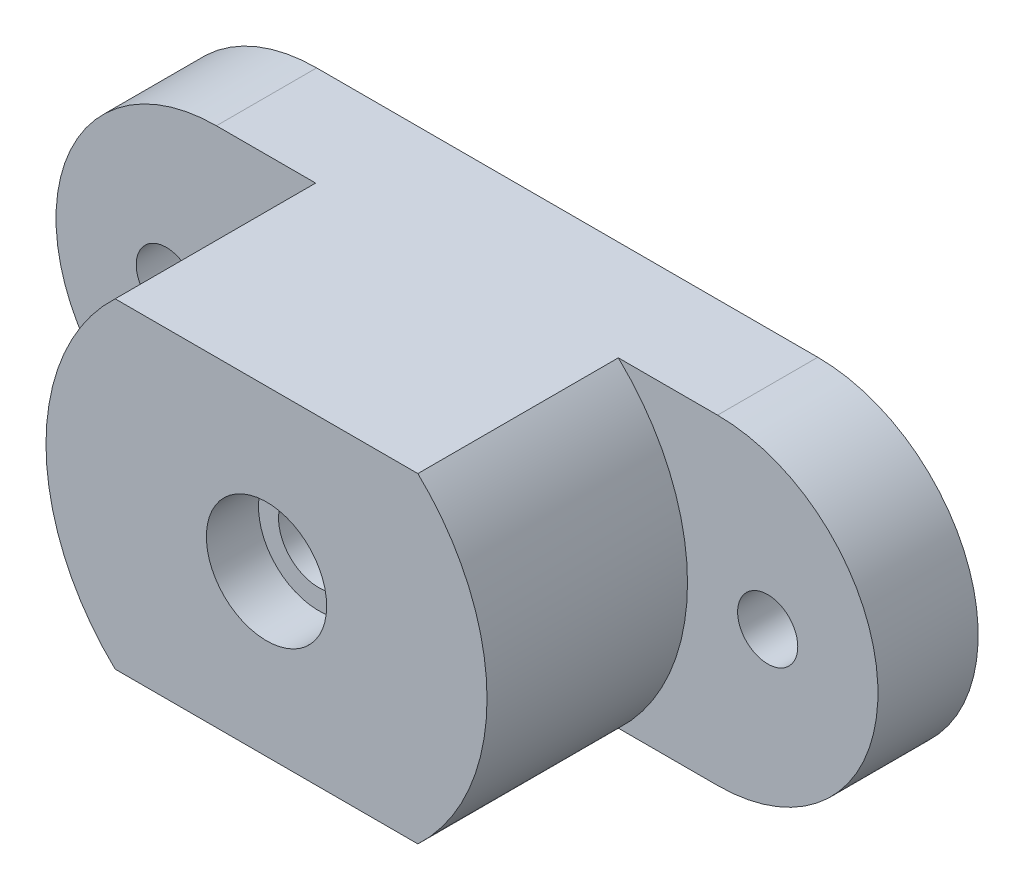
ISO-10303-21;
HEADER;
FILE_DESCRIPTION(('STEP AP214'),'2;1');
FILE_NAME('part.step','',(''),(''),'','','');
FILE_SCHEMA(('AUTOMOTIVE_DESIGN { 1 0 10303 214 1 1 1 1 }'));
ENDSEC;
DATA;
#1=APPLICATION_CONTEXT('core data for automotive mechanical design processes');
#2=APPLICATION_PROTOCOL_DEFINITION('international standard','automotive_design',2000,#1);
#3=PRODUCT_CONTEXT('',#1,'mechanical');
#4=PRODUCT('Part','Part','',(#3));
#5=PRODUCT_RELATED_PRODUCT_CATEGORY('part','',(#4));
#6=PRODUCT_DEFINITION_FORMATION('','',#4);
#7=PRODUCT_DEFINITION_CONTEXT('part definition',#1,'design');
#8=PRODUCT_DEFINITION('design','',#6,#7);
#9=PRODUCT_DEFINITION_SHAPE('','',#8);
#10=(LENGTH_UNIT() NAMED_UNIT(*) SI_UNIT(.MILLI.,.METRE.));
#11=(NAMED_UNIT(*) PLANE_ANGLE_UNIT() SI_UNIT($,.RADIAN.));
#12=(NAMED_UNIT(*) SI_UNIT($,.STERADIAN.) SOLID_ANGLE_UNIT());
#13=UNCERTAINTY_MEASURE_WITH_UNIT(LENGTH_MEASURE(1.E-05),#10,'distance_accuracy_value','');
#14=(GEOMETRIC_REPRESENTATION_CONTEXT(3) GLOBAL_UNCERTAINTY_ASSIGNED_CONTEXT((#13)) GLOBAL_UNIT_ASSIGNED_CONTEXT((#10,
#11,#12)) REPRESENTATION_CONTEXT('',''));
#15=CARTESIAN_POINT('',(0.,0.,0.));
#16=DIRECTION('',(0.,0.,1.));
#17=DIRECTION('',(1.,0.,0.));
#18=AXIS2_PLACEMENT_3D('',#15,#16,#17);
#19=CARTESIAN_POINT('',(12.5,0.,0.));
#20=DIRECTION('',(0.,0.,1.));
#21=DIRECTION('',(1.,0.,0.));
#22=AXIS2_PLACEMENT_3D('',#19,#20,#21);
#23=CYLINDRICAL_SURFACE('',#22,2.);
#24=CARTESIAN_POINT('',(12.5,0.,12.4));
#25=DIRECTION('',(0.,0.,1.));
#26=DIRECTION('',(1.,0.,0.));
#27=AXIS2_PLACEMENT_3D('',#24,#25,#26);
#28=CIRCLE('',#27,2.);
#29=CARTESIAN_POINT('',(14.5,0.,12.4));
#30=VERTEX_POINT('',#29);
#31=EDGE_CURVE('E188',#30,#30,#28,.T.);
#32=CARTESIAN_POINT('',(12.5,0.,10.));
#33=DIRECTION('',(0.,0.,-1.));
#34=DIRECTION('',(-1.,0.,0.));
#35=AXIS2_PLACEMENT_3D('',#32,#33,#34);
#36=CIRCLE('',#35,2.);
#37=CARTESIAN_POINT('',(14.5,0.,10.));
#38=VERTEX_POINT('',#37);
#39=EDGE_CURVE('E43',#38,#38,#36,.F.);
#40=CARTESIAN_POINT('',(14.5,0.,12.4));
#41=CARTESIAN_POINT('',(14.5,0.,12.375));
#42=CARTESIAN_POINT('',(14.5,0.,12.35));
#43=CARTESIAN_POINT('',(14.5,0.,12.3));
#44=CARTESIAN_POINT('',(14.5,0.,12.275));
#45=CARTESIAN_POINT('',(14.5,0.,12.225));
#46=CARTESIAN_POINT('',(14.5,0.,12.2));
#47=CARTESIAN_POINT('',(14.5,0.,12.15));
#48=CARTESIAN_POINT('',(14.5,0.,12.125));
#49=CARTESIAN_POINT('',(14.5,0.,12.075));
#50=CARTESIAN_POINT('',(14.5,0.,12.05));
#51=CARTESIAN_POINT('',(14.5,0.,12.));
#52=CARTESIAN_POINT('',(14.5,0.,11.975));
#53=CARTESIAN_POINT('',(14.5,0.,11.925));
#54=CARTESIAN_POINT('',(14.5,0.,11.9));
#55=CARTESIAN_POINT('',(14.5,0.,11.85));
#56=CARTESIAN_POINT('',(14.5,0.,11.825));
#57=CARTESIAN_POINT('',(14.5,0.,11.775));
#58=CARTESIAN_POINT('',(14.5,0.,11.75));
#59=CARTESIAN_POINT('',(14.5,0.,11.7));
#60=CARTESIAN_POINT('',(14.5,0.,11.675));
#61=CARTESIAN_POINT('',(14.5,0.,11.625));
#62=CARTESIAN_POINT('',(14.5,0.,11.6));
#63=CARTESIAN_POINT('',(14.5,0.,11.55));
#64=CARTESIAN_POINT('',(14.5,0.,11.525));
#65=CARTESIAN_POINT('',(14.5,0.,11.475));
#66=CARTESIAN_POINT('',(14.5,0.,11.45));
#67=CARTESIAN_POINT('',(14.5,0.,11.4));
#68=CARTESIAN_POINT('',(14.5,0.,11.375));
#69=CARTESIAN_POINT('',(14.5,0.,11.325));
#70=CARTESIAN_POINT('',(14.5,0.,11.3));
#71=CARTESIAN_POINT('',(14.5,0.,11.25));
#72=CARTESIAN_POINT('',(14.5,0.,11.225));
#73=CARTESIAN_POINT('',(14.5,0.,11.175));
#74=CARTESIAN_POINT('',(14.5,0.,11.15));
#75=CARTESIAN_POINT('',(14.5,0.,11.1));
#76=CARTESIAN_POINT('',(14.5,0.,11.075));
#77=CARTESIAN_POINT('',(14.5,0.,11.025));
#78=CARTESIAN_POINT('',(14.5,0.,11.));
#79=CARTESIAN_POINT('',(14.5,0.,10.95));
#80=CARTESIAN_POINT('',(14.5,0.,10.925));
#81=CARTESIAN_POINT('',(14.5,0.,10.875));
#82=CARTESIAN_POINT('',(14.5,0.,10.85));
#83=CARTESIAN_POINT('',(14.5,0.,10.8));
#84=CARTESIAN_POINT('',(14.5,0.,10.775));
#85=CARTESIAN_POINT('',(14.5,0.,10.725));
#86=CARTESIAN_POINT('',(14.5,0.,10.7));
#87=CARTESIAN_POINT('',(14.5,0.,10.65));
#88=CARTESIAN_POINT('',(14.5,0.,10.625));
#89=CARTESIAN_POINT('',(14.5,0.,10.575));
#90=CARTESIAN_POINT('',(14.5,0.,10.55));
#91=CARTESIAN_POINT('',(14.5,0.,10.5));
#92=CARTESIAN_POINT('',(14.5,0.,10.475));
#93=CARTESIAN_POINT('',(14.5,0.,10.425));
#94=CARTESIAN_POINT('',(14.5,0.,10.4));
#95=CARTESIAN_POINT('',(14.5,0.,10.35));
#96=CARTESIAN_POINT('',(14.5,0.,10.325));
#97=CARTESIAN_POINT('',(14.5,0.,10.275));
#98=CARTESIAN_POINT('',(14.5,0.,10.25));
#99=CARTESIAN_POINT('',(14.5,0.,10.2));
#100=CARTESIAN_POINT('',(14.5,0.,10.175));
#101=CARTESIAN_POINT('',(14.5,0.,10.125));
#102=CARTESIAN_POINT('',(14.5,0.,10.1));
#103=CARTESIAN_POINT('',(14.5,0.,10.05));
#104=CARTESIAN_POINT('',(14.5,0.,10.025));
#105=CARTESIAN_POINT('',(14.5,0.,10.));
#106=B_SPLINE_CURVE_WITH_KNOTS('',3,(#40,#41,#42,#43,#44,#45,#46,#47,#48,#49,#50,#51,#52,#53,
#54,#55,#56,#57,#58,#59,#60,#61,#62,#63,#64,#65,#66,#67,#68,#69,#70,#71,#72,#73,#74,#75,#76,#77,
#78,#79,#80,#81,#82,#83,#84,#85,#86,#87,#88,#89,#90,#91,#92,#93,#94,#95,#96,#97,#98,#99,#100,
#101,#102,#103,#104,#105),.UNSPECIFIED.,.F.,.F.,(4,2,2,2,2,2,2,2,2,2,2,2,2,2,2,2,2,2,2,2,2,2,2,
2,2,2,2,2,2,2,2,2,4),(0.,0.0750000000000004,0.150000000000001,0.225,0.3,0.375,0.449999999999999,
0.524999999999999,0.6,0.675,0.750000000000001,0.824999999999999,0.9,0.975,1.05,1.125,1.2,1.275,
1.35,1.425,1.5,1.575,1.65,1.725,1.8,1.875,1.95,2.025,2.1,2.175,2.25,2.325,2.4),.UNSPECIFIED.);
#107=EDGE_CURVE('BSEAM39',#30,#38,#106,.T.);
#108=ORIENTED_EDGE('',*,*,#31,.T.);
#109=ORIENTED_EDGE('',*,*,#39,.F.);
#110=ORIENTED_EDGE('',*,*,#107,.T.);
#111=ORIENTED_EDGE('',*,*,#107,.F.);
#112=EDGE_LOOP('',(#108,#110,#109,#111));
#113=FACE_BOUND('',#112,.T.);
#114=ADVANCED_FACE('F39',(#113),#23,.F.);
#115=CARTESIAN_POINT('',(0.,0.,5.));
#116=DIRECTION('',(0.,0.,1.));
#117=DIRECTION('',(1.,0.,0.));
#118=AXIS2_PLACEMENT_3D('',#115,#116,#117);
#119=PLANE('',#118);
#120=CARTESIAN_POINT('',(-2.5,0.,5.));
#121=DIRECTION('',(0.,0.,1.));
#122=DIRECTION('',(1.,0.,0.));
#123=AXIS2_PLACEMENT_3D('',#120,#121,#122);
#124=CIRCLE('',#123,1.5);
#125=CARTESIAN_POINT('',(-1.,0.,5.));
#126=VERTEX_POINT('',#125);
#127=EDGE_CURVE('E206',#126,#126,#124,.T.);
#128=ORIENTED_EDGE('',*,*,#127,.F.);
#129=EDGE_LOOP('',(#128));
#130=FACE_BOUND('',#129,.T.);
#131=CARTESIAN_POINT('',(12.5,0.,5.));
#132=DIRECTION('',(0.,0.,1.));
#133=DIRECTION('',(1.,0.,0.));
#134=AXIS2_PLACEMENT_3D('',#131,#132,#133);
#135=CIRCLE('',#134,11.);
#136=CARTESIAN_POINT('',(4.95016556472925,8.,5.));
#137=VERTEX_POINT('',#136);
#138=CARTESIAN_POINT('',(4.95016556472925,-8.,5.));
#139=VERTEX_POINT('',#138);
#140=EDGE_CURVE('E55',#137,#139,#135,.T.);
#141=ORIENTED_EDGE('',*,*,#140,.F.);
#142=DIRECTION('',(-1.,0.,0.));
#143=VECTOR('',#142,1.);
#144=CARTESIAN_POINT('',(0.,8.,5.));
#145=LINE('',#144,#143);
#146=CARTESIAN_POINT('',(0.,8.,5.));
#147=VERTEX_POINT('',#146);
#148=EDGE_CURVE('E144',#137,#147,#145,.T.);
#149=ORIENTED_EDGE('',*,*,#148,.T.);
#150=CARTESIAN_POINT('',(0.,0.,5.));
#151=DIRECTION('',(0.,0.,1.));
#152=DIRECTION('',(1.,0.,0.));
#153=AXIS2_PLACEMENT_3D('',#150,#151,#152);
#154=CIRCLE('',#153,8.);
#155=CARTESIAN_POINT('',(0.,-8.,5.));
#156=VERTEX_POINT('',#155);
#157=EDGE_CURVE('E135',#147,#156,#154,.T.);
#158=ORIENTED_EDGE('',*,*,#157,.T.);
#159=DIRECTION('',(1.,0.,0.));
#160=VECTOR('',#159,1.);
#161=CARTESIAN_POINT('',(0.,-8.,5.));
#162=LINE('',#161,#160);
#163=EDGE_CURVE('E140',#156,#139,#162,.T.);
#164=ORIENTED_EDGE('',*,*,#163,.T.);
#165=EDGE_LOOP('',(#141,#149,#158,#164));
#166=FACE_BOUND('',#165,.T.);
#167=ADVANCED_FACE('F175',(#130,#166),#119,.T.);
#168=CARTESIAN_POINT('',(0.,0.,5.));
#169=DIRECTION('',(0.,0.,-1.));
#170=DIRECTION('',(-1.,0.,0.));
#171=AXIS2_PLACEMENT_3D('',#168,#169,#170);
#172=CYLINDRICAL_SURFACE('',#171,8.);
#173=CARTESIAN_POINT('',(0.,0.,0.));
#174=DIRECTION('',(0.,0.,1.));
#175=DIRECTION('',(1.,0.,0.));
#176=AXIS2_PLACEMENT_3D('',#173,#174,#175);
#177=CIRCLE('',#176,8.);
#178=CARTESIAN_POINT('',(0.,8.,0.));
#179=VERTEX_POINT('',#178);
#180=CARTESIAN_POINT('',(0.,-8.,0.));
#181=VERTEX_POINT('',#180);
#182=EDGE_CURVE('E126',#179,#181,#177,.T.);
#183=ORIENTED_EDGE('',*,*,#182,.T.);
#184=DIRECTION('',(0.,0.,-1.));
#185=VECTOR('',#184,1.);
#186=CARTESIAN_POINT('',(0.,-8.,5.));
#187=LINE('',#186,#185);
#188=EDGE_CURVE('E11',#156,#181,#187,.T.);
#189=ORIENTED_EDGE('',*,*,#188,.F.);
#190=ORIENTED_EDGE('',*,*,#157,.F.);
#191=DIRECTION('',(0.,0.,-1.));
#192=VECTOR('',#191,1.);
#193=CARTESIAN_POINT('',(0.,8.,5.));
#194=LINE('',#193,#192);
#195=EDGE_CURVE('E146',#147,#179,#194,.T.);
#196=ORIENTED_EDGE('',*,*,#195,.T.);
#197=EDGE_LOOP('',(#183,#189,#190,#196));
#198=FACE_BOUND('',#197,.T.);
#199=ADVANCED_FACE('F41',(#198),#172,.T.);
#200=CARTESIAN_POINT('',(0.,-8.,5.));
#201=DIRECTION('',(0.,1.,0.));
#202=DIRECTION('',(0.,0.,1.));
#203=AXIS2_PLACEMENT_3D('',#200,#201,#202);
#204=PLANE('',#203);
#205=DIRECTION('',(1.,0.,0.));
#206=VECTOR('',#205,1.);
#207=CARTESIAN_POINT('',(0.,-8.,0.));
#208=LINE('',#207,#206);
#209=CARTESIAN_POINT('',(25.,-8.,0.));
#210=VERTEX_POINT('',#209);
#211=EDGE_CURVE('E129',#181,#210,#208,.T.);
#212=ORIENTED_EDGE('',*,*,#211,.T.);
#213=DIRECTION('',(0.,0.,-1.));
#214=VECTOR('',#213,1.);
#215=CARTESIAN_POINT('',(25.,-8.,5.));
#216=LINE('',#215,#214);
#217=CARTESIAN_POINT('',(25.,-8.,5.));
#218=VERTEX_POINT('',#217);
#219=EDGE_CURVE('E48',#218,#210,#216,.T.);
#220=ORIENTED_EDGE('',*,*,#219,.F.);
#221=CARTESIAN_POINT('',(20.0498344352707,-8.,5.));
#222=VERTEX_POINT('',#221);
#223=EDGE_CURVE('E138',#222,#218,#162,.T.);
#224=ORIENTED_EDGE('',*,*,#223,.F.);
#225=DIRECTION('',(0.,0.,-1.));
#226=VECTOR('',#225,1.);
#227=CARTESIAN_POINT('',(20.0498344352707,-8.,15.));
#228=LINE('',#227,#226);
#229=CARTESIAN_POINT('',(20.0498344352707,-8.,15.));
#230=VERTEX_POINT('',#229);
#231=EDGE_CURVE('E111',#230,#222,#228,.T.);
#232=ORIENTED_EDGE('',*,*,#231,.F.);
#233=DIRECTION('',(1.,0.,0.));
#234=VECTOR('',#233,1.);
#235=CARTESIAN_POINT('',(4.95016556472925,-8.,15.));
#236=LINE('',#235,#234);
#237=CARTESIAN_POINT('',(4.95016556472925,-8.,15.));
#238=VERTEX_POINT('',#237);
#239=EDGE_CURVE('E105',#238,#230,#236,.T.);
#240=ORIENTED_EDGE('',*,*,#239,.F.);
#241=DIRECTION('',(0.,0.,-1.));
#242=VECTOR('',#241,1.);
#243=CARTESIAN_POINT('',(4.95016556472925,-8.,15.));
#244=LINE('',#243,#242);
#245=EDGE_CURVE('E109',#238,#139,#244,.T.);
#246=ORIENTED_EDGE('',*,*,#245,.T.);
#247=ORIENTED_EDGE('',*,*,#163,.F.);
#248=ORIENTED_EDGE('',*,*,#188,.T.);
#249=EDGE_LOOP('',(#212,#220,#224,#232,#240,#246,#247,#248));
#250=FACE_BOUND('',#249,.T.);
#251=ADVANCED_FACE('F107',(#250),#204,.F.);
#252=CARTESIAN_POINT('',(25.,0.,5.));
#253=DIRECTION('',(0.,0.,-1.));
#254=DIRECTION('',(-1.,0.,0.));
#255=AXIS2_PLACEMENT_3D('',#252,#253,#254);
#256=CYLINDRICAL_SURFACE('',#255,8.);
#257=CARTESIAN_POINT('',(25.,0.,0.));
#258=DIRECTION('',(0.,0.,1.));
#259=DIRECTION('',(1.,0.,0.));
#260=AXIS2_PLACEMENT_3D('',#257,#258,#259);
#261=CIRCLE('',#260,8.);
#262=CARTESIAN_POINT('',(25.,8.,0.));
#263=VERTEX_POINT('',#262);
#264=EDGE_CURVE('E149',#210,#263,#261,.T.);
#265=ORIENTED_EDGE('',*,*,#264,.T.);
#266=DIRECTION('',(0.,0.,-1.));
#267=VECTOR('',#266,1.);
#268=CARTESIAN_POINT('',(25.,8.,5.));
#269=LINE('',#268,#267);
#270=CARTESIAN_POINT('',(25.,8.,5.));
#271=VERTEX_POINT('',#270);
#272=EDGE_CURVE('E154',#271,#263,#269,.T.);
#273=ORIENTED_EDGE('',*,*,#272,.F.);
#274=CARTESIAN_POINT('',(25.,0.,5.));
#275=DIRECTION('',(0.,0.,1.));
#276=DIRECTION('',(1.,0.,0.));
#277=AXIS2_PLACEMENT_3D('',#274,#275,#276);
#278=CIRCLE('',#277,8.);
#279=EDGE_CURVE('E142',#218,#271,#278,.T.);
#280=ORIENTED_EDGE('',*,*,#279,.F.);
#281=ORIENTED_EDGE('',*,*,#219,.T.);
#282=EDGE_LOOP('',(#265,#273,#280,#281));
#283=FACE_BOUND('',#282,.T.);
#284=ADVANCED_FACE('F162',(#283),#256,.T.);
#285=CARTESIAN_POINT('',(0.,8.,5.));
#286=DIRECTION('',(0.,-1.,0.));
#287=DIRECTION('',(0.,0.,-1.));
#288=AXIS2_PLACEMENT_3D('',#285,#286,#287);
#289=PLANE('',#288);
#290=DIRECTION('',(-1.,0.,0.));
#291=VECTOR('',#290,1.);
#292=CARTESIAN_POINT('',(0.,8.,0.));
#293=LINE('',#292,#291);
#294=EDGE_CURVE('E139',#263,#179,#293,.T.);
#295=ORIENTED_EDGE('',*,*,#294,.T.);
#296=ORIENTED_EDGE('',*,*,#195,.F.);
#297=ORIENTED_EDGE('',*,*,#148,.F.);
#298=DIRECTION('',(0.,0.,-1.));
#299=VECTOR('',#298,1.);
#300=CARTESIAN_POINT('',(4.95016556472925,8.,15.));
#301=LINE('',#300,#299);
#302=CARTESIAN_POINT('',(4.95016556472925,8.,15.));
#303=VERTEX_POINT('',#302);
#304=EDGE_CURVE('E176',#303,#137,#301,.T.);
#305=ORIENTED_EDGE('',*,*,#304,.F.);
#306=DIRECTION('',(-1.,0.,0.));
#307=VECTOR('',#306,1.);
#308=CARTESIAN_POINT('',(20.0498344352707,8.,15.));
#309=LINE('',#308,#307);
#310=CARTESIAN_POINT('',(20.0498344352707,8.,15.));
#311=VERTEX_POINT('',#310);
#312=EDGE_CURVE('E120',#311,#303,#309,.T.);
#313=ORIENTED_EDGE('',*,*,#312,.F.);
#314=DIRECTION('',(0.,0.,-1.));
#315=VECTOR('',#314,1.);
#316=CARTESIAN_POINT('',(20.0498344352707,8.,15.));
#317=LINE('',#316,#315);
#318=CARTESIAN_POINT('',(20.0498344352707,8.,5.));
#319=VERTEX_POINT('',#318);
#320=EDGE_CURVE('E131',#311,#319,#317,.T.);
#321=ORIENTED_EDGE('',*,*,#320,.T.);
#322=EDGE_CURVE('E145',#271,#319,#145,.T.);
#323=ORIENTED_EDGE('',*,*,#322,.F.);
#324=ORIENTED_EDGE('',*,*,#272,.T.);
#325=EDGE_LOOP('',(#295,#296,#297,#305,#313,#321,#323,#324));
#326=FACE_BOUND('',#325,.T.);
#327=ADVANCED_FACE('F170',(#326),#289,.F.);
#328=CARTESIAN_POINT('',(27.5,0.,5.));
#329=DIRECTION('',(0.,0.,1.));
#330=DIRECTION('',(1.,0.,0.));
#331=AXIS2_PLACEMENT_3D('',#328,#329,#330);
#332=CIRCLE('',#331,1.5);
#333=CARTESIAN_POINT('',(29.,0.,5.));
#334=VERTEX_POINT('',#333);
#335=EDGE_CURVE('E203',#334,#334,#332,.T.);
#336=ORIENTED_EDGE('',*,*,#335,.F.);
#337=EDGE_LOOP('',(#336));
#338=FACE_BOUND('',#337,.T.);
#339=CARTESIAN_POINT('',(12.5,0.,5.));
#340=DIRECTION('',(0.,0.,1.));
#341=DIRECTION('',(1.,0.,0.));
#342=AXIS2_PLACEMENT_3D('',#339,#340,#341);
#343=CIRCLE('',#342,11.);
#344=EDGE_CURVE('E63',#222,#319,#343,.T.);
#345=ORIENTED_EDGE('',*,*,#344,.F.);
#346=ORIENTED_EDGE('',*,*,#223,.T.);
#347=ORIENTED_EDGE('',*,*,#279,.T.);
#348=ORIENTED_EDGE('',*,*,#322,.T.);
#349=EDGE_LOOP('',(#345,#346,#347,#348));
#350=FACE_BOUND('',#349,.T.);
#351=ADVANCED_FACE('F223',(#338,#350),#119,.T.);
#352=CARTESIAN_POINT('',(0.,0.,0.));
#353=DIRECTION('',(0.,0.,1.));
#354=DIRECTION('',(1.,0.,0.));
#355=AXIS2_PLACEMENT_3D('',#352,#353,#354);
#356=PLANE('',#355);
#357=CARTESIAN_POINT('',(-2.5,0.,0.));
#358=DIRECTION('',(0.,0.,1.));
#359=DIRECTION('',(1.,0.,0.));
#360=AXIS2_PLACEMENT_3D('',#357,#358,#359);
#361=CIRCLE('',#360,1.5);
#362=CARTESIAN_POINT('',(-1.,0.,0.));
#363=VERTEX_POINT('',#362);
#364=EDGE_CURVE('E197',#363,#363,#361,.T.);
#365=ORIENTED_EDGE('',*,*,#364,.T.);
#366=EDGE_LOOP('',(#365));
#367=FACE_BOUND('',#366,.T.);
#368=CARTESIAN_POINT('',(27.5,0.,0.));
#369=DIRECTION('',(0.,0.,1.));
#370=DIRECTION('',(1.,0.,0.));
#371=AXIS2_PLACEMENT_3D('',#368,#369,#370);
#372=CIRCLE('',#371,1.5);
#373=CARTESIAN_POINT('',(29.,0.,0.));
#374=VERTEX_POINT('',#373);
#375=EDGE_CURVE('E200',#374,#374,#372,.T.);
#376=ORIENTED_EDGE('',*,*,#375,.T.);
#377=EDGE_LOOP('',(#376));
#378=FACE_BOUND('',#377,.T.);
#379=CARTESIAN_POINT('',(12.5,0.,0.));
#380=DIRECTION('',(0.,0.,-1.));
#381=DIRECTION('',(-1.,0.,0.));
#382=AXIS2_PLACEMENT_3D('',#379,#380,#381);
#383=CIRCLE('',#382,6.);
#384=CARTESIAN_POINT('',(6.5,0.,0.));
#385=VERTEX_POINT('',#384);
#386=EDGE_CURVE('E193',#385,#385,#383,.T.);
#387=ORIENTED_EDGE('',*,*,#386,.F.);
#388=EDGE_LOOP('',(#387));
#389=FACE_BOUND('',#388,.T.);
#390=ORIENTED_EDGE('',*,*,#182,.F.);
#391=ORIENTED_EDGE('',*,*,#294,.F.);
#392=ORIENTED_EDGE('',*,*,#264,.F.);
#393=ORIENTED_EDGE('',*,*,#211,.F.);
#394=EDGE_LOOP('',(#390,#391,#392,#393));
#395=FACE_BOUND('',#394,.T.);
#396=ADVANCED_FACE('F167',(#367,#378,#389,#395),#356,.F.);
#397=CARTESIAN_POINT('',(12.5,0.,15.));
#398=DIRECTION('',(0.,0.,-1.));
#399=DIRECTION('',(-1.,0.,0.));
#400=AXIS2_PLACEMENT_3D('',#397,#398,#399);
#401=CYLINDRICAL_SURFACE('',#400,11.);
#402=ORIENTED_EDGE('',*,*,#140,.T.);
#403=ORIENTED_EDGE('',*,*,#245,.F.);
#404=CARTESIAN_POINT('',(12.5,0.,15.));
#405=DIRECTION('',(0.,0.,1.));
#406=DIRECTION('',(1.,0.,0.));
#407=AXIS2_PLACEMENT_3D('',#404,#405,#406);
#408=CIRCLE('',#407,11.);
#409=EDGE_CURVE('E115',#303,#238,#408,.T.);
#410=ORIENTED_EDGE('',*,*,#409,.F.);
#411=ORIENTED_EDGE('',*,*,#304,.T.);
#412=EDGE_LOOP('',(#402,#403,#410,#411));
#413=FACE_BOUND('',#412,.T.);
#414=ADVANCED_FACE('F125',(#413),#401,.T.);
#415=CARTESIAN_POINT('',(12.5,0.,15.));
#416=DIRECTION('',(0.,0.,-1.));
#417=DIRECTION('',(-1.,0.,0.));
#418=AXIS2_PLACEMENT_3D('',#415,#416,#417);
#419=CYLINDRICAL_SURFACE('',#418,11.);
#420=ORIENTED_EDGE('',*,*,#344,.T.);
#421=ORIENTED_EDGE('',*,*,#320,.F.);
#422=CARTESIAN_POINT('',(12.5,0.,15.));
#423=DIRECTION('',(0.,0.,1.));
#424=DIRECTION('',(1.,0.,0.));
#425=AXIS2_PLACEMENT_3D('',#422,#423,#424);
#426=CIRCLE('',#425,11.);
#427=EDGE_CURVE('E114',#230,#311,#426,.T.);
#428=ORIENTED_EDGE('',*,*,#427,.F.);
#429=ORIENTED_EDGE('',*,*,#231,.T.);
#430=EDGE_LOOP('',(#420,#421,#428,#429));
#431=FACE_BOUND('',#430,.T.);
#432=ADVANCED_FACE('F266',(#431),#419,.T.);
#433=CARTESIAN_POINT('',(12.5,0.,15.));
#434=DIRECTION('',(0.,0.,1.));
#435=DIRECTION('',(1.,0.,0.));
#436=AXIS2_PLACEMENT_3D('',#433,#434,#435);
#437=PLANE('',#436);
#438=CARTESIAN_POINT('',(12.5,0.,15.));
#439=DIRECTION('',(0.,0.,1.));
#440=DIRECTION('',(1.,0.,0.));
#441=AXIS2_PLACEMENT_3D('',#438,#439,#440);
#442=CIRCLE('',#441,3.);
#443=CARTESIAN_POINT('',(15.5,0.,15.));
#444=VERTEX_POINT('',#443);
#445=EDGE_CURVE('E185',#444,#444,#442,.T.);
#446=ORIENTED_EDGE('',*,*,#445,.F.);
#447=EDGE_LOOP('',(#446));
#448=FACE_BOUND('',#447,.T.);
#449=ORIENTED_EDGE('',*,*,#409,.T.);
#450=ORIENTED_EDGE('',*,*,#239,.T.);
#451=ORIENTED_EDGE('',*,*,#427,.T.);
#452=ORIENTED_EDGE('',*,*,#312,.T.);
#453=EDGE_LOOP('',(#449,#450,#451,#452));
#454=FACE_BOUND('',#453,.T.);
#455=ADVANCED_FACE('F118',(#448,#454),#437,.T.);
#456=CARTESIAN_POINT('',(12.5,0.,12.4));
#457=DIRECTION('',(0.,0.,1.));
#458=DIRECTION('',(1.,0.,0.));
#459=AXIS2_PLACEMENT_3D('',#456,#457,#458);
#460=CYLINDRICAL_SURFACE('',#459,3.);
#461=CARTESIAN_POINT('',(12.5,0.,12.4));
#462=DIRECTION('',(0.,0.,1.));
#463=DIRECTION('',(1.,0.,0.));
#464=AXIS2_PLACEMENT_3D('',#461,#462,#463);
#465=CIRCLE('',#464,3.);
#466=CARTESIAN_POINT('',(15.5,0.,12.4));
#467=VERTEX_POINT('',#466);
#468=EDGE_CURVE('E182',#467,#467,#465,.T.);
#469=ORIENTED_EDGE('',*,*,#468,.F.);
#470=EDGE_LOOP('',(#469));
#471=FACE_BOUND('',#470,.T.);
#472=ORIENTED_EDGE('',*,*,#445,.T.);
#473=EDGE_LOOP('',(#472));
#474=FACE_BOUND('',#473,.T.);
#475=ADVANCED_FACE('F259',(#471,#474),#460,.F.);
#476=CARTESIAN_POINT('',(12.5,0.,12.4));
#477=DIRECTION('',(0.,0.,1.));
#478=DIRECTION('',(1.,0.,0.));
#479=AXIS2_PLACEMENT_3D('',#476,#477,#478);
#480=PLANE('',#479);
#481=ORIENTED_EDGE('',*,*,#31,.F.);
#482=EDGE_LOOP('',(#481));
#483=FACE_BOUND('',#482,.T.);
#484=ORIENTED_EDGE('',*,*,#468,.T.);
#485=EDGE_LOOP('',(#484));
#486=FACE_BOUND('',#485,.T.);
#487=ADVANCED_FACE('F254',(#483,#486),#480,.T.);
#488=CARTESIAN_POINT('',(12.5,0.,10.));
#489=DIRECTION('',(0.,0.,-1.));
#490=DIRECTION('',(-1.,0.,0.));
#491=AXIS2_PLACEMENT_3D('',#488,#489,#490);
#492=PLANE('',#491);
#493=CARTESIAN_POINT('',(12.5,0.,10.));
#494=DIRECTION('',(0.,0.,-1.));
#495=DIRECTION('',(-1.,0.,0.));
#496=AXIS2_PLACEMENT_3D('',#493,#494,#495);
#497=CIRCLE('',#496,6.);
#498=CARTESIAN_POINT('',(6.5,0.,10.));
#499=VERTEX_POINT('',#498);
#500=EDGE_CURVE('E196',#499,#499,#497,.T.);
#501=ORIENTED_EDGE('',*,*,#500,.T.);
#502=EDGE_LOOP('',(#501));
#503=FACE_BOUND('',#502,.T.);
#504=ORIENTED_EDGE('',*,*,#39,.T.);
#505=EDGE_LOOP('',(#504));
#506=FACE_BOUND('',#505,.T.);
#507=ADVANCED_FACE('F248',(#503,#506),#492,.T.);
#508=CARTESIAN_POINT('',(12.5,0.,10.));
#509=DIRECTION('',(0.,0.,-1.));
#510=DIRECTION('',(-1.,0.,0.));
#511=AXIS2_PLACEMENT_3D('',#508,#509,#510);
#512=CYLINDRICAL_SURFACE('',#511,6.);
#513=ORIENTED_EDGE('',*,*,#500,.F.);
#514=EDGE_LOOP('',(#513));
#515=FACE_BOUND('',#514,.T.);
#516=ORIENTED_EDGE('',*,*,#386,.T.);
#517=EDGE_LOOP('',(#516));
#518=FACE_BOUND('',#517,.T.);
#519=ADVANCED_FACE('F242',(#515,#518),#512,.F.);
#520=CARTESIAN_POINT('',(27.5,0.,0.));
#521=DIRECTION('',(0.,0.,1.));
#522=DIRECTION('',(1.,0.,0.));
#523=AXIS2_PLACEMENT_3D('',#520,#521,#522);
#524=CYLINDRICAL_SURFACE('',#523,1.5);
#525=ORIENTED_EDGE('',*,*,#375,.F.);
#526=EDGE_LOOP('',(#525));
#527=FACE_BOUND('',#526,.T.);
#528=ORIENTED_EDGE('',*,*,#335,.T.);
#529=EDGE_LOOP('',(#528));
#530=FACE_BOUND('',#529,.T.);
#531=ADVANCED_FACE('F217',(#527,#530),#524,.F.);
#532=CARTESIAN_POINT('',(-2.5,0.,0.));
#533=DIRECTION('',(0.,0.,1.));
#534=DIRECTION('',(1.,0.,0.));
#535=AXIS2_PLACEMENT_3D('',#532,#533,#534);
#536=CYLINDRICAL_SURFACE('',#535,1.5);
#537=ORIENTED_EDGE('',*,*,#364,.F.);
#538=EDGE_LOOP('',(#537));
#539=FACE_BOUND('',#538,.T.);
#540=ORIENTED_EDGE('',*,*,#127,.T.);
#541=EDGE_LOOP('',(#540));
#542=FACE_BOUND('',#541,.T.);
#543=ADVANCED_FACE('F214',(#539,#542),#536,.F.);
#544=CLOSED_SHELL('',(#114,#167,#199,#251,#284,#327,#351,#396,#414,#432,#455,#475,#487,#507,
#519,#531,#543));
#545=MANIFOLD_SOLID_BREP('B2',#544);
#546=ADVANCED_BREP_SHAPE_REPRESENTATION('',(#18,#545),#14);
#547=SHAPE_DEFINITION_REPRESENTATION(#9,#546);
ENDSEC;
END-ISO-10303-21;
